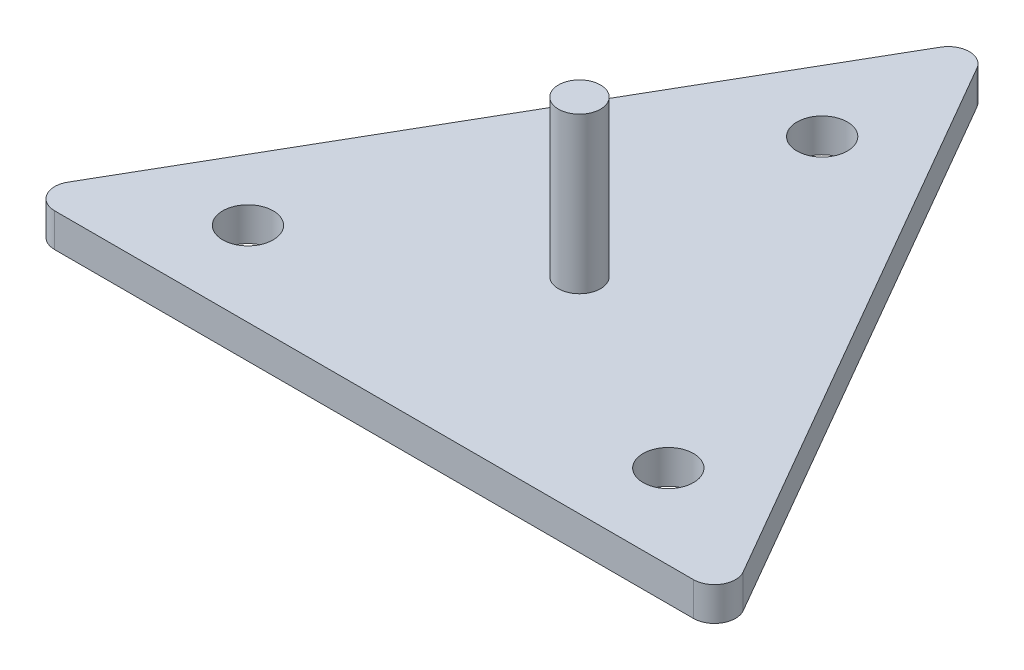
ISO-10303-21;
HEADER;
FILE_DESCRIPTION(('STEP AP214'),'2;1');
FILE_NAME('part.step','',(''),(''),'','','');
FILE_SCHEMA(('AUTOMOTIVE_DESIGN { 1 0 10303 214 1 1 1 1 }'));
ENDSEC;
DATA;
#1=APPLICATION_CONTEXT('core data for automotive mechanical design processes');
#2=APPLICATION_PROTOCOL_DEFINITION('international standard','automotive_design',2000,#1);
#3=PRODUCT_CONTEXT('',#1,'mechanical');
#4=PRODUCT('Part','Part','',(#3));
#5=PRODUCT_RELATED_PRODUCT_CATEGORY('part','',(#4));
#6=PRODUCT_DEFINITION_FORMATION('','',#4);
#7=PRODUCT_DEFINITION_CONTEXT('part definition',#1,'design');
#8=PRODUCT_DEFINITION('design','',#6,#7);
#9=PRODUCT_DEFINITION_SHAPE('','',#8);
#10=(LENGTH_UNIT() NAMED_UNIT(*) SI_UNIT(.MILLI.,.METRE.));
#11=(NAMED_UNIT(*) PLANE_ANGLE_UNIT() SI_UNIT($,.RADIAN.));
#12=(NAMED_UNIT(*) SI_UNIT($,.STERADIAN.) SOLID_ANGLE_UNIT());
#13=UNCERTAINTY_MEASURE_WITH_UNIT(LENGTH_MEASURE(1.E-05),#10,'distance_accuracy_value','');
#14=(GEOMETRIC_REPRESENTATION_CONTEXT(3) GLOBAL_UNCERTAINTY_ASSIGNED_CONTEXT((#13)) GLOBAL_UNIT_ASSIGNED_CONTEXT((#10,
#11,#12)) REPRESENTATION_CONTEXT('',''));
#15=CARTESIAN_POINT('',(0.,0.,0.));
#16=DIRECTION('',(0.,0.,1.));
#17=DIRECTION('',(1.,0.,0.));
#18=AXIS2_PLACEMENT_3D('',#15,#16,#17);
#19=CARTESIAN_POINT('',(-150.327290661181,8.,-100.509002325515));
#20=DIRECTION('',(-0.866025403784439,0.,-0.5));
#21=DIRECTION('',(-0.5,0.,0.866025403784439));
#22=AXIS2_PLACEMENT_3D('',#19,#20,#21);
#23=PLANE('',#22);
#24=DIRECTION('',(0.5,0.,-0.866025403784439));
#25=VECTOR('',#24,1.);
#26=CARTESIAN_POINT('',(-150.327290661181,0.,-100.509002325515));
#27=LINE('',#26,#25);
#28=CARTESIAN_POINT('',(-145.997163642259,0.,-108.009002325515));
#29=VERTEX_POINT('',#28);
#30=CARTESIAN_POINT('',(-70.016401528726,0.,-239.611542703959));
#31=VERTEX_POINT('',#30);
#32=EDGE_CURVE('E132',#29,#31,#27,.T.);
#33=ORIENTED_EDGE('',*,*,#32,.F.);
#34=DIRECTION('',(0.,-1.,0.));
#35=VECTOR('',#34,1.);
#36=CARTESIAN_POINT('',(-145.997163642259,8.,-108.009002325515));
#37=LINE('',#36,#35);
#38=CARTESIAN_POINT('',(-145.997163642259,8.,-108.009002325515));
#39=VERTEX_POINT('',#38);
#40=EDGE_CURVE('E119',#29,#39,#37,.F.);
#41=ORIENTED_EDGE('',*,*,#40,.T.);
#42=DIRECTION('',(0.5,0.,-0.866025403784439));
#43=VECTOR('',#42,1.);
#44=CARTESIAN_POINT('',(-150.327290661181,8.,-100.509002325515));
#45=LINE('',#44,#43);
#46=CARTESIAN_POINT('',(-70.016401528726,8.,-239.611542703959));
#47=VERTEX_POINT('',#46);
#48=EDGE_CURVE('E104',#39,#47,#45,.T.);
#49=ORIENTED_EDGE('',*,*,#48,.T.);
#50=DIRECTION('',(0.,-1.,0.));
#51=VECTOR('',#50,1.);
#52=CARTESIAN_POINT('',(-70.016401528726,8.,-239.611542703959));
#53=LINE('',#52,#51);
#54=EDGE_CURVE('E116',#47,#31,#53,.T.);
#55=ORIENTED_EDGE('',*,*,#54,.T.);
#56=EDGE_LOOP('',(#33,#41,#49,#55));
#57=FACE_BOUND('',#56,.T.);
#58=ADVANCED_FACE('F33',(#57),#23,.T.);
#59=CARTESIAN_POINT('',(18.9547416415737,8.,-100.509002325515));
#60=DIRECTION('',(0.,0.,1.));
#61=DIRECTION('',(1.,0.,0.));
#62=AXIS2_PLACEMENT_3D('',#59,#60,#61);
#63=PLANE('',#62);
#64=DIRECTION('',(-1.,0.,0.));
#65=VECTOR('',#64,1.);
#66=CARTESIAN_POINT('',(18.9547416415737,8.,-100.509002325515));
#67=LINE('',#66,#65);
#68=CARTESIAN_POINT('',(10.2944876037293,8.,-100.509002325515));
#69=VERTEX_POINT('',#68);
#70=CARTESIAN_POINT('',(-141.667036623337,8.,-100.509002325515));
#71=VERTEX_POINT('',#70);
#72=EDGE_CURVE('E106',#69,#71,#67,.T.);
#73=ORIENTED_EDGE('',*,*,#72,.T.);
#74=DIRECTION('',(0.,-1.,0.));
#75=VECTOR('',#74,1.);
#76=CARTESIAN_POINT('',(-141.667036623337,8.,-100.509002325515));
#77=LINE('',#76,#75);
#78=CARTESIAN_POINT('',(-141.667036623337,0.,-100.509002325515));
#79=VERTEX_POINT('',#78);
#80=EDGE_CURVE('E96',#71,#79,#77,.T.);
#81=ORIENTED_EDGE('',*,*,#80,.T.);
#82=DIRECTION('',(-1.,0.,0.));
#83=VECTOR('',#82,1.);
#84=CARTESIAN_POINT('',(18.9547416415737,0.,-100.509002325515));
#85=LINE('',#84,#83);
#86=CARTESIAN_POINT('',(10.2944876037293,0.,-100.509002325515));
#87=VERTEX_POINT('',#86);
#88=EDGE_CURVE('E89',#87,#79,#85,.T.);
#89=ORIENTED_EDGE('',*,*,#88,.F.);
#90=DIRECTION('',(0.,-1.,0.));
#91=VECTOR('',#90,1.);
#92=CARTESIAN_POINT('',(10.2944876037293,8.,-100.509002325515));
#93=LINE('',#92,#91);
#94=EDGE_CURVE('E102',#87,#69,#93,.F.);
#95=ORIENTED_EDGE('',*,*,#94,.T.);
#96=EDGE_LOOP('',(#73,#81,#89,#95));
#97=FACE_BOUND('',#96,.T.);
#98=ADVANCED_FACE('F101',(#97),#63,.T.);
#99=CARTESIAN_POINT('',(-65.6862745098038,8.,-247.111542703959));
#100=DIRECTION('',(0.866025403784439,0.,-0.5));
#101=DIRECTION('',(-0.5,0.,-0.866025403784439));
#102=AXIS2_PLACEMENT_3D('',#99,#100,#101);
#103=PLANE('',#102);
#104=DIRECTION('',(0.5,0.,0.866025403784439));
#105=VECTOR('',#104,1.);
#106=CARTESIAN_POINT('',(-65.6862745098038,0.,-247.111542703959));
#107=LINE('',#106,#105);
#108=CARTESIAN_POINT('',(-61.3561474908816,0.,-239.611542703959));
#109=VERTEX_POINT('',#108);
#110=CARTESIAN_POINT('',(14.6246146226515,0.,-108.009002325515));
#111=VERTEX_POINT('',#110);
#112=EDGE_CURVE('E90',#109,#111,#107,.T.);
#113=ORIENTED_EDGE('',*,*,#112,.F.);
#114=DIRECTION('',(0.,-1.,0.));
#115=VECTOR('',#114,1.);
#116=CARTESIAN_POINT('',(-61.3561474908816,8.,-239.611542703959));
#117=LINE('',#116,#115);
#118=CARTESIAN_POINT('',(-61.3561474908816,8.,-239.611542703959));
#119=VERTEX_POINT('',#118);
#120=EDGE_CURVE('E11',#109,#119,#117,.F.);
#121=ORIENTED_EDGE('',*,*,#120,.T.);
#122=DIRECTION('',(0.5,0.,0.866025403784439));
#123=VECTOR('',#122,1.);
#124=CARTESIAN_POINT('',(-65.6862745098038,8.,-247.111542703959));
#125=LINE('',#124,#123);
#126=CARTESIAN_POINT('',(14.6246146226515,8.,-108.009002325515));
#127=VERTEX_POINT('',#126);
#128=EDGE_CURVE('E109',#119,#127,#125,.T.);
#129=ORIENTED_EDGE('',*,*,#128,.T.);
#130=DIRECTION('',(0.,-1.,0.));
#131=VECTOR('',#130,1.);
#132=CARTESIAN_POINT('',(14.6246146226515,8.,-108.009002325515));
#133=LINE('',#132,#131);
#134=EDGE_CURVE('E41',#127,#111,#133,.T.);
#135=ORIENTED_EDGE('',*,*,#134,.T.);
#136=EDGE_LOOP('',(#113,#121,#129,#135));
#137=FACE_BOUND('',#136,.T.);
#138=ADVANCED_FACE('F125',(#137),#103,.T.);
#139=CARTESIAN_POINT('',(0.,8.,0.));
#140=DIRECTION('',(0.,-1.,0.));
#141=DIRECTION('',(0.,0.,-1.));
#142=AXIS2_PLACEMENT_3D('',#139,#140,#141);
#143=PLANE('',#142);
#144=CARTESIAN_POINT('',(-65.6862745098038,8.,-149.376515784997));
#145=DIRECTION('',(0.,-1.,0.));
#146=DIRECTION('',(0.,0.,-1.));
#147=AXIS2_PLACEMENT_3D('',#144,#145,#146);
#148=CIRCLE('',#147,5.00000000000001);
#149=CARTESIAN_POINT('',(-65.6862745098038,8.00000000000001,-154.376515784997));
#150=VERTEX_POINT('',#149);
#151=EDGE_CURVE('E155',#150,#150,#148,.T.);
#152=ORIENTED_EDGE('',*,*,#151,.T.);
#153=EDGE_LOOP('',(#152));
#154=FACE_BOUND('',#153,.T.);
#155=CARTESIAN_POINT('',(-65.6862745098038,8.,-207.111542703959));
#156=DIRECTION('',(0.,1.,0.));
#157=DIRECTION('',(0.,0.,1.));
#158=AXIS2_PLACEMENT_3D('',#155,#156,#157);
#159=CIRCLE('',#158,6.);
#160=CARTESIAN_POINT('',(-65.6862745098038,8.,-201.111542703959));
#161=VERTEX_POINT('',#160);
#162=EDGE_CURVE('E152',#161,#161,#159,.T.);
#163=ORIENTED_EDGE('',*,*,#162,.F.);
#164=EDGE_LOOP('',(#163));
#165=FACE_BOUND('',#164,.T.);
#166=CARTESIAN_POINT('',(-115.686274509804,8.,-120.509002325515));
#167=DIRECTION('',(0.,1.,0.));
#168=DIRECTION('',(0.,0.,1.));
#169=AXIS2_PLACEMENT_3D('',#166,#167,#168);
#170=CIRCLE('',#169,6.00000000000001);
#171=CARTESIAN_POINT('',(-115.686274509804,8.,-114.509002325515));
#172=VERTEX_POINT('',#171);
#173=EDGE_CURVE('E146',#172,#172,#170,.T.);
#174=ORIENTED_EDGE('',*,*,#173,.F.);
#175=EDGE_LOOP('',(#174));
#176=FACE_BOUND('',#175,.T.);
#177=CARTESIAN_POINT('',(-15.6862745098038,8.,-120.509002325515));
#178=DIRECTION('',(0.,1.,0.));
#179=DIRECTION('',(0.,0.,1.));
#180=AXIS2_PLACEMENT_3D('',#177,#178,#179);
#181=CIRCLE('',#180,6.);
#182=CARTESIAN_POINT('',(-15.6862745098038,8.,-114.509002325515));
#183=VERTEX_POINT('',#182);
#184=EDGE_CURVE('E137',#183,#183,#181,.T.);
#185=ORIENTED_EDGE('',*,*,#184,.F.);
#186=EDGE_LOOP('',(#185));
#187=FACE_BOUND('',#186,.T.);
#188=ORIENTED_EDGE('',*,*,#48,.F.);
#189=CARTESIAN_POINT('',(-141.667036623337,8.,-105.509002325515));
#190=DIRECTION('',(0.,-1.,0.));
#191=DIRECTION('',(0.,0.,-1.));
#192=AXIS2_PLACEMENT_3D('',#189,#190,#191);
#193=CIRCLE('',#192,5.);
#194=EDGE_CURVE('E124',#39,#71,#193,.F.);
#195=ORIENTED_EDGE('',*,*,#194,.T.);
#196=ORIENTED_EDGE('',*,*,#72,.F.);
#197=CARTESIAN_POINT('',(10.2944876037293,8.,-105.509002325515));
#198=DIRECTION('',(0.,-1.,0.));
#199=DIRECTION('',(0.,0.,-1.));
#200=AXIS2_PLACEMENT_3D('',#197,#198,#199);
#201=CIRCLE('',#200,5.);
#202=EDGE_CURVE('E48',#69,#127,#201,.F.);
#203=ORIENTED_EDGE('',*,*,#202,.T.);
#204=ORIENTED_EDGE('',*,*,#128,.F.);
#205=CARTESIAN_POINT('',(-65.6862745098038,8.,-237.111542703959));
#206=DIRECTION('',(0.,-1.,0.));
#207=DIRECTION('',(0.,0.,-1.));
#208=AXIS2_PLACEMENT_3D('',#205,#206,#207);
#209=CIRCLE('',#208,5.);
#210=EDGE_CURVE('E122',#119,#47,#209,.F.);
#211=ORIENTED_EDGE('',*,*,#210,.T.);
#212=EDGE_LOOP('',(#188,#195,#196,#203,#204,#211));
#213=FACE_BOUND('',#212,.T.);
#214=ADVANCED_FACE('F193',(#154,#165,#176,#187,#213),#143,.F.);
#215=CARTESIAN_POINT('',(0.,0.,0.));
#216=DIRECTION('',(0.,-1.,0.));
#217=DIRECTION('',(0.,0.,-1.));
#218=AXIS2_PLACEMENT_3D('',#215,#216,#217);
#219=PLANE('',#218);
#220=CARTESIAN_POINT('',(-65.6862745098038,0.,-207.111542703959));
#221=DIRECTION('',(0.,1.,0.));
#222=DIRECTION('',(0.,0.,1.));
#223=AXIS2_PLACEMENT_3D('',#220,#221,#222);
#224=CIRCLE('',#223,6.);
#225=CARTESIAN_POINT('',(-65.6862745098038,0.,-201.111542703959));
#226=VERTEX_POINT('',#225);
#227=EDGE_CURVE('E149',#226,#226,#224,.T.);
#228=ORIENTED_EDGE('',*,*,#227,.T.);
#229=EDGE_LOOP('',(#228));
#230=FACE_BOUND('',#229,.T.);
#231=CARTESIAN_POINT('',(-115.686274509804,0.,-120.509002325515));
#232=DIRECTION('',(0.,1.,0.));
#233=DIRECTION('',(0.,0.,1.));
#234=AXIS2_PLACEMENT_3D('',#231,#232,#233);
#235=CIRCLE('',#234,5.99999999999999);
#236=CARTESIAN_POINT('',(-115.686274509804,0.,-114.509002325515));
#237=VERTEX_POINT('',#236);
#238=EDGE_CURVE('E141',#237,#237,#235,.T.);
#239=ORIENTED_EDGE('',*,*,#238,.T.);
#240=EDGE_LOOP('',(#239));
#241=FACE_BOUND('',#240,.T.);
#242=CARTESIAN_POINT('',(-15.6862745098038,0.,-120.509002325515));
#243=DIRECTION('',(0.,1.,0.));
#244=DIRECTION('',(0.,0.,1.));
#245=AXIS2_PLACEMENT_3D('',#242,#243,#244);
#246=CIRCLE('',#245,6.);
#247=CARTESIAN_POINT('',(-15.6862745098038,0.,-114.509002325515));
#248=VERTEX_POINT('',#247);
#249=EDGE_CURVE('E134',#248,#248,#246,.T.);
#250=ORIENTED_EDGE('',*,*,#249,.T.);
#251=EDGE_LOOP('',(#250));
#252=FACE_BOUND('',#251,.T.);
#253=ORIENTED_EDGE('',*,*,#88,.T.);
#254=CARTESIAN_POINT('',(-141.667036623337,0.,-105.509002325515));
#255=DIRECTION('',(0.,-1.,0.));
#256=DIRECTION('',(0.,0.,-1.));
#257=AXIS2_PLACEMENT_3D('',#254,#255,#256);
#258=CIRCLE('',#257,5.);
#259=EDGE_CURVE('E114',#79,#29,#258,.T.);
#260=ORIENTED_EDGE('',*,*,#259,.T.);
#261=ORIENTED_EDGE('',*,*,#32,.T.);
#262=CARTESIAN_POINT('',(-65.6862745098038,0.,-237.111542703959));
#263=DIRECTION('',(0.,-1.,0.));
#264=DIRECTION('',(0.,0.,-1.));
#265=AXIS2_PLACEMENT_3D('',#262,#263,#264);
#266=CIRCLE('',#265,5.);
#267=EDGE_CURVE('E95',#31,#109,#266,.T.);
#268=ORIENTED_EDGE('',*,*,#267,.T.);
#269=ORIENTED_EDGE('',*,*,#112,.T.);
#270=CARTESIAN_POINT('',(10.2944876037293,0.,-105.509002325515));
#271=DIRECTION('',(0.,-1.,0.));
#272=DIRECTION('',(0.,0.,-1.));
#273=AXIS2_PLACEMENT_3D('',#270,#271,#272);
#274=CIRCLE('',#273,5.);
#275=EDGE_CURVE('E86',#111,#87,#274,.T.);
#276=ORIENTED_EDGE('',*,*,#275,.T.);
#277=EDGE_LOOP('',(#253,#260,#261,#268,#269,#276));
#278=FACE_BOUND('',#277,.T.);
#279=ADVANCED_FACE('F88',(#230,#241,#252,#278),#219,.T.);
#280=CARTESIAN_POINT('',(-15.6862745098038,8.,-120.509002325515));
#281=DIRECTION('',(0.,1.,0.));
#282=DIRECTION('',(0.,0.,1.));
#283=AXIS2_PLACEMENT_3D('',#280,#281,#282);
#284=CYLINDRICAL_SURFACE('',#283,6.);
#285=ORIENTED_EDGE('',*,*,#249,.F.);
#286=EDGE_LOOP('',(#285));
#287=FACE_BOUND('',#286,.T.);
#288=ORIENTED_EDGE('',*,*,#184,.T.);
#289=EDGE_LOOP('',(#288));
#290=FACE_BOUND('',#289,.T.);
#291=ADVANCED_FACE('F203',(#287,#290),#284,.F.);
#292=CARTESIAN_POINT('',(-115.686274509804,8.,-120.509002325515));
#293=DIRECTION('',(0.,1.,0.));
#294=DIRECTION('',(0.,0.,1.));
#295=AXIS2_PLACEMENT_3D('',#292,#293,#294);
#296=CYLINDRICAL_SURFACE('',#295,6.);
#297=ORIENTED_EDGE('',*,*,#238,.F.);
#298=EDGE_LOOP('',(#297));
#299=FACE_BOUND('',#298,.T.);
#300=ORIENTED_EDGE('',*,*,#173,.T.);
#301=EDGE_LOOP('',(#300));
#302=FACE_BOUND('',#301,.T.);
#303=ADVANCED_FACE('F210',(#299,#302),#296,.F.);
#304=CARTESIAN_POINT('',(-65.6862745098038,8.,-207.111542703959));
#305=DIRECTION('',(0.,1.,0.));
#306=DIRECTION('',(0.,0.,1.));
#307=AXIS2_PLACEMENT_3D('',#304,#305,#306);
#308=CYLINDRICAL_SURFACE('',#307,6.);
#309=ORIENTED_EDGE('',*,*,#227,.F.);
#310=EDGE_LOOP('',(#309));
#311=FACE_BOUND('',#310,.T.);
#312=ORIENTED_EDGE('',*,*,#162,.T.);
#313=EDGE_LOOP('',(#312));
#314=FACE_BOUND('',#313,.T.);
#315=ADVANCED_FACE('F176',(#311,#314),#308,.F.);
#316=CARTESIAN_POINT('',(-65.6862745098038,45.,-149.376515784997));
#317=DIRECTION('',(0.,-1.,0.));
#318=DIRECTION('',(0.,0.,-1.));
#319=AXIS2_PLACEMENT_3D('',#316,#317,#318);
#320=CYLINDRICAL_SURFACE('',#319,5.00000000000001);
#321=CARTESIAN_POINT('',(-65.6862745098038,45.,-149.376515784997));
#322=DIRECTION('',(0.,-1.,0.));
#323=DIRECTION('',(0.,0.,-1.));
#324=AXIS2_PLACEMENT_3D('',#321,#322,#323);
#325=CIRCLE('',#324,5.00000000000001);
#326=CARTESIAN_POINT('',(-65.6862745098038,45.,-154.376515784997));
#327=VERTEX_POINT('',#326);
#328=EDGE_CURVE('E158',#327,#327,#325,.T.);
#329=CARTESIAN_POINT('',(-65.6862745098038,45.,-154.376515784997));
#330=CARTESIAN_POINT('',(-65.6862745098038,44.6145833333333,-154.376515784997));
#331=CARTESIAN_POINT('',(-65.6862745098038,44.2291666666667,-154.376515784997));
#332=CARTESIAN_POINT('',(-65.6862745098038,43.4583333333333,-154.376515784997));
#333=CARTESIAN_POINT('',(-65.6862745098038,43.0729166666667,-154.376515784997));
#334=CARTESIAN_POINT('',(-65.6862745098038,42.3020833333333,-154.376515784997));
#335=CARTESIAN_POINT('',(-65.6862745098038,41.9166666666667,-154.376515784997));
#336=CARTESIAN_POINT('',(-65.6862745098038,41.1458333333333,-154.376515784997));
#337=CARTESIAN_POINT('',(-65.6862745098038,40.7604166666667,-154.376515784997));
#338=CARTESIAN_POINT('',(-65.6862745098038,39.9895833333333,-154.376515784997));
#339=CARTESIAN_POINT('',(-65.6862745098038,39.6041666666667,-154.376515784997));
#340=CARTESIAN_POINT('',(-65.6862745098038,38.8333333333333,-154.376515784997));
#341=CARTESIAN_POINT('',(-65.6862745098038,38.4479166666667,-154.376515784997));
#342=CARTESIAN_POINT('',(-65.6862745098038,37.6770833333333,-154.376515784997));
#343=CARTESIAN_POINT('',(-65.6862745098038,37.2916666666667,-154.376515784997));
#344=CARTESIAN_POINT('',(-65.6862745098038,36.5208333333333,-154.376515784997));
#345=CARTESIAN_POINT('',(-65.6862745098038,36.1354166666667,-154.376515784997));
#346=CARTESIAN_POINT('',(-65.6862745098038,35.3645833333333,-154.376515784997));
#347=CARTESIAN_POINT('',(-65.6862745098038,34.9791666666667,-154.376515784997));
#348=CARTESIAN_POINT('',(-65.6862745098038,34.2083333333333,-154.376515784997));
#349=CARTESIAN_POINT('',(-65.6862745098038,33.8229166666667,-154.376515784997));
#350=CARTESIAN_POINT('',(-65.6862745098038,33.0520833333333,-154.376515784997));
#351=CARTESIAN_POINT('',(-65.6862745098038,32.6666666666667,-154.376515784997));
#352=CARTESIAN_POINT('',(-65.6862745098038,31.8958333333333,-154.376515784997));
#353=CARTESIAN_POINT('',(-65.6862745098038,31.5104166666667,-154.376515784997));
#354=CARTESIAN_POINT('',(-65.6862745098038,30.7395833333333,-154.376515784997));
#355=CARTESIAN_POINT('',(-65.6862745098038,30.3541666666667,-154.376515784997));
#356=CARTESIAN_POINT('',(-65.6862745098038,29.5833333333333,-154.376515784997));
#357=CARTESIAN_POINT('',(-65.6862745098038,29.1979166666667,-154.376515784997));
#358=CARTESIAN_POINT('',(-65.6862745098038,28.4270833333333,-154.376515784997));
#359=CARTESIAN_POINT('',(-65.6862745098038,28.0416666666667,-154.376515784997));
#360=CARTESIAN_POINT('',(-65.6862745098038,27.2708333333333,-154.376515784997));
#361=CARTESIAN_POINT('',(-65.6862745098038,26.8854166666667,-154.376515784997));
#362=CARTESIAN_POINT('',(-65.6862745098038,26.1145833333333,-154.376515784997));
#363=CARTESIAN_POINT('',(-65.6862745098038,25.7291666666667,-154.376515784997));
#364=CARTESIAN_POINT('',(-65.6862745098038,24.9583333333333,-154.376515784997));
#365=CARTESIAN_POINT('',(-65.6862745098038,24.5729166666667,-154.376515784997));
#366=CARTESIAN_POINT('',(-65.6862745098038,23.8020833333333,-154.376515784997));
#367=CARTESIAN_POINT('',(-65.6862745098038,23.4166666666667,-154.376515784997));
#368=CARTESIAN_POINT('',(-65.6862745098038,22.6458333333333,-154.376515784997));
#369=CARTESIAN_POINT('',(-65.6862745098038,22.2604166666667,-154.376515784997));
#370=CARTESIAN_POINT('',(-65.6862745098038,21.4895833333333,-154.376515784997));
#371=CARTESIAN_POINT('',(-65.6862745098038,21.1041666666667,-154.376515784997));
#372=CARTESIAN_POINT('',(-65.6862745098038,20.3333333333333,-154.376515784997));
#373=CARTESIAN_POINT('',(-65.6862745098038,19.9479166666667,-154.376515784997));
#374=CARTESIAN_POINT('',(-65.6862745098038,19.1770833333333,-154.376515784997));
#375=CARTESIAN_POINT('',(-65.6862745098038,18.7916666666667,-154.376515784997));
#376=CARTESIAN_POINT('',(-65.6862745098038,18.0208333333333,-154.376515784997));
#377=CARTESIAN_POINT('',(-65.6862745098038,17.6354166666667,-154.376515784997));
#378=CARTESIAN_POINT('',(-65.6862745098038,16.8645833333333,-154.376515784997));
#379=CARTESIAN_POINT('',(-65.6862745098038,16.4791666666667,-154.376515784997));
#380=CARTESIAN_POINT('',(-65.6862745098038,15.7083333333333,-154.376515784997));
#381=CARTESIAN_POINT('',(-65.6862745098038,15.3229166666667,-154.376515784997));
#382=CARTESIAN_POINT('',(-65.6862745098038,14.5520833333333,-154.376515784997));
#383=CARTESIAN_POINT('',(-65.6862745098038,14.1666666666667,-154.376515784997));
#384=CARTESIAN_POINT('',(-65.6862745098038,13.3958333333333,-154.376515784997));
#385=CARTESIAN_POINT('',(-65.6862745098038,13.0104166666667,-154.376515784997));
#386=CARTESIAN_POINT('',(-65.6862745098038,12.2395833333333,-154.376515784997));
#387=CARTESIAN_POINT('',(-65.6862745098038,11.8541666666667,-154.376515784997));
#388=CARTESIAN_POINT('',(-65.6862745098038,11.0833333333333,-154.376515784997));
#389=CARTESIAN_POINT('',(-65.6862745098038,10.6979166666667,-154.376515784997));
#390=CARTESIAN_POINT('',(-65.6862745098038,9.92708333333334,-154.376515784997));
#391=CARTESIAN_POINT('',(-65.6862745098038,9.54166666666667,-154.376515784997));
#392=CARTESIAN_POINT('',(-65.6862745098038,8.77083333333334,-154.376515784997));
#393=CARTESIAN_POINT('',(-65.6862745098038,8.38541666666667,-154.376515784997));
#394=CARTESIAN_POINT('',(-65.6862745098038,8.00000000000001,-154.376515784997));
#395=B_SPLINE_CURVE_WITH_KNOTS('',3,(#329,#330,#331,#332,#333,#334,#335,#336,#337,#338,#339,
#340,#341,#342,#343,#344,#345,#346,#347,#348,#349,#350,#351,#352,#353,#354,#355,#356,#357,#358,
#359,#360,#361,#362,#363,#364,#365,#366,#367,#368,#369,#370,#371,#372,#373,#374,#375,#376,#377,
#378,#379,#380,#381,#382,#383,#384,#385,#386,#387,#388,#389,#390,#391,#392,#393,#394),
.UNSPECIFIED.,.F.,.F.,(4,2,2,2,2,2,2,2,2,2,2,2,2,2,2,2,2,2,2,2,2,2,2,2,2,2,2,2,2,2,2,2,4),(0.,
1.15625,2.3125,3.46875,4.625,5.78124999999999,6.9375,8.09375,9.24999999999999,10.40625,11.5625,
12.71875,13.875,15.03125,16.1875,17.34375,18.5,19.65625,20.8125,21.96875,23.125,24.28125,
25.4375,26.59375,27.75,28.90625,30.0625,31.21875,32.375,33.53125,34.6875,35.84375,37.),.UNSPECIFIED.);
#396=EDGE_CURVE('BSEAM162',#327,#150,#395,.T.);
#397=ORIENTED_EDGE('',*,*,#328,.T.);
#398=ORIENTED_EDGE('',*,*,#151,.F.);
#399=ORIENTED_EDGE('',*,*,#396,.T.);
#400=ORIENTED_EDGE('',*,*,#396,.F.);
#401=EDGE_LOOP('',(#397,#399,#398,#400));
#402=FACE_BOUND('',#401,.T.);
#403=ADVANCED_FACE('F162',(#402),#320,.T.);
#404=CARTESIAN_POINT('',(-65.6862745098038,45.,-149.376515784997));
#405=DIRECTION('',(0.,-1.,0.));
#406=DIRECTION('',(0.,0.,-1.));
#407=AXIS2_PLACEMENT_3D('',#404,#405,#406);
#408=PLANE('',#407);
#409=ORIENTED_EDGE('',*,*,#328,.F.);
#410=EDGE_LOOP('',(#409));
#411=FACE_BOUND('',#410,.T.);
#412=ADVANCED_FACE('F165',(#411),#408,.F.);
#413=CARTESIAN_POINT('',(-141.667036623337,8.,-105.509002325515));
#414=DIRECTION('',(0.,-1.,0.));
#415=DIRECTION('',(0.,0.,-1.));
#416=AXIS2_PLACEMENT_3D('',#413,#414,#415);
#417=CYLINDRICAL_SURFACE('',#416,5.);
#418=ORIENTED_EDGE('',*,*,#194,.F.);
#419=ORIENTED_EDGE('',*,*,#40,.F.);
#420=ORIENTED_EDGE('',*,*,#259,.F.);
#421=ORIENTED_EDGE('',*,*,#80,.F.);
#422=EDGE_LOOP('',(#418,#419,#420,#421));
#423=FACE_BOUND('',#422,.T.);
#424=ADVANCED_FACE('F167',(#423),#417,.T.);
#425=CARTESIAN_POINT('',(-65.6862745098038,8.,-237.111542703959));
#426=DIRECTION('',(0.,-1.,0.));
#427=DIRECTION('',(0.,0.,-1.));
#428=AXIS2_PLACEMENT_3D('',#425,#426,#427);
#429=CYLINDRICAL_SURFACE('',#428,5.);
#430=ORIENTED_EDGE('',*,*,#210,.F.);
#431=ORIENTED_EDGE('',*,*,#120,.F.);
#432=ORIENTED_EDGE('',*,*,#267,.F.);
#433=ORIENTED_EDGE('',*,*,#54,.F.);
#434=EDGE_LOOP('',(#430,#431,#432,#433));
#435=FACE_BOUND('',#434,.T.);
#436=ADVANCED_FACE('F173',(#435),#429,.T.);
#437=CARTESIAN_POINT('',(10.2944876037293,8.,-105.509002325515));
#438=DIRECTION('',(0.,-1.,0.));
#439=DIRECTION('',(0.,0.,-1.));
#440=AXIS2_PLACEMENT_3D('',#437,#438,#439);
#441=CYLINDRICAL_SURFACE('',#440,5.);
#442=ORIENTED_EDGE('',*,*,#202,.F.);
#443=ORIENTED_EDGE('',*,*,#94,.F.);
#444=ORIENTED_EDGE('',*,*,#275,.F.);
#445=ORIENTED_EDGE('',*,*,#134,.F.);
#446=EDGE_LOOP('',(#442,#443,#444,#445));
#447=FACE_BOUND('',#446,.T.);
#448=ADVANCED_FACE('F35',(#447),#441,.T.);
#449=CLOSED_SHELL('',(#58,#98,#138,#214,#279,#291,#303,#315,#403,#412,#424,#436,#448));
#450=MANIFOLD_SOLID_BREP('B2',#449);
#451=ADVANCED_BREP_SHAPE_REPRESENTATION('',(#18,#450),#14);
#452=SHAPE_DEFINITION_REPRESENTATION(#9,#451);
ENDSEC;
END-ISO-10303-21;
